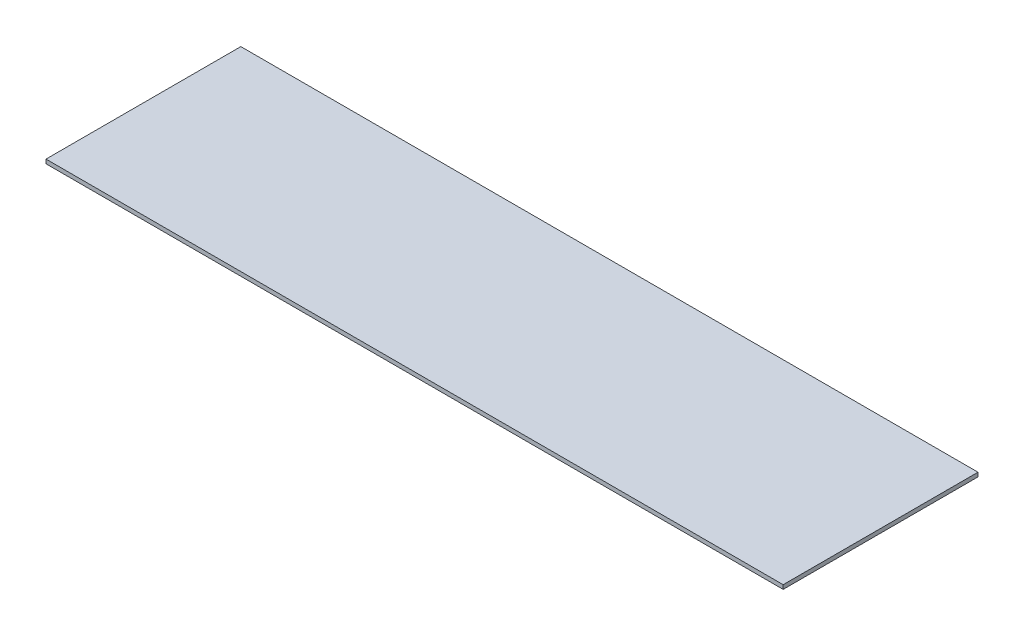
ISO-10303-21;
HEADER;
FILE_DESCRIPTION(('STEP AP214'),'2;1');
FILE_NAME('part.step','',(''),(''),'','','');
FILE_SCHEMA(('AUTOMOTIVE_DESIGN { 1 0 10303 214 1 1 1 1 }'));
ENDSEC;
DATA;
#1=APPLICATION_CONTEXT('core data for automotive mechanical design processes');
#2=APPLICATION_PROTOCOL_DEFINITION('international standard','automotive_design',2000,#1);
#3=PRODUCT_CONTEXT('',#1,'mechanical');
#4=PRODUCT('Part','Part','',(#3));
#5=PRODUCT_RELATED_PRODUCT_CATEGORY('part','',(#4));
#6=PRODUCT_DEFINITION_FORMATION('','',#4);
#7=PRODUCT_DEFINITION_CONTEXT('part definition',#1,'design');
#8=PRODUCT_DEFINITION('design','',#6,#7);
#9=PRODUCT_DEFINITION_SHAPE('','',#8);
#10=(LENGTH_UNIT() NAMED_UNIT(*) SI_UNIT(.MILLI.,.METRE.));
#11=(NAMED_UNIT(*) PLANE_ANGLE_UNIT() SI_UNIT($,.RADIAN.));
#12=(NAMED_UNIT(*) SI_UNIT($,.STERADIAN.) SOLID_ANGLE_UNIT());
#13=UNCERTAINTY_MEASURE_WITH_UNIT(LENGTH_MEASURE(1.E-05),#10,'distance_accuracy_value','');
#14=(GEOMETRIC_REPRESENTATION_CONTEXT(3) GLOBAL_UNCERTAINTY_ASSIGNED_CONTEXT((#13)) GLOBAL_UNIT_ASSIGNED_CONTEXT((#10,
#11,#12)) REPRESENTATION_CONTEXT('',''));
#15=CARTESIAN_POINT('',(0.,0.,0.));
#16=DIRECTION('',(0.,0.,1.));
#17=DIRECTION('',(1.,0.,0.));
#18=AXIS2_PLACEMENT_3D('',#15,#16,#17);
#19=CARTESIAN_POINT('',(0.,1.27,0.));
#20=DIRECTION('',(1.,0.,0.));
#21=DIRECTION('',(0.,0.,-1.));
#22=AXIS2_PLACEMENT_3D('',#19,#20,#21);
#23=PLANE('',#22);
#24=DIRECTION('',(0.,0.,1.));
#25=VECTOR('',#24,1.);
#26=CARTESIAN_POINT('',(0.,0.,0.));
#27=LINE('',#26,#25);
#28=CARTESIAN_POINT('',(0.,0.,-60.452));
#29=VERTEX_POINT('',#28);
#30=CARTESIAN_POINT('',(0.,0.,0.));
#31=VERTEX_POINT('',#30);
#32=EDGE_CURVE('E96',#29,#31,#27,.T.);
#33=ORIENTED_EDGE('',*,*,#32,.T.);
#34=DIRECTION('',(0.,-1.,0.));
#35=VECTOR('',#34,1.);
#36=CARTESIAN_POINT('',(0.,1.27,0.));
#37=LINE('',#36,#35);
#38=CARTESIAN_POINT('',(0.,1.27,0.));
#39=VERTEX_POINT('',#38);
#40=EDGE_CURVE('E11',#39,#31,#37,.T.);
#41=ORIENTED_EDGE('',*,*,#40,.F.);
#42=DIRECTION('',(0.,0.,1.));
#43=VECTOR('',#42,1.);
#44=CARTESIAN_POINT('',(0.,1.27,0.));
#45=LINE('',#44,#43);
#46=CARTESIAN_POINT('',(0.,1.27,-60.452));
#47=VERTEX_POINT('',#46);
#48=EDGE_CURVE('E84',#47,#39,#45,.T.);
#49=ORIENTED_EDGE('',*,*,#48,.F.);
#50=DIRECTION('',(0.,-1.,0.));
#51=VECTOR('',#50,1.);
#52=CARTESIAN_POINT('',(0.,1.27,-60.452));
#53=LINE('',#52,#51);
#54=EDGE_CURVE('E92',#47,#29,#53,.T.);
#55=ORIENTED_EDGE('',*,*,#54,.T.);
#56=EDGE_LOOP('',(#33,#41,#49,#55));
#57=FACE_BOUND('',#56,.T.);
#58=ADVANCED_FACE('F33',(#57),#23,.F.);
#59=CARTESIAN_POINT('',(0.,1.27,0.));
#60=DIRECTION('',(0.,0.,-1.));
#61=DIRECTION('',(-1.,0.,0.));
#62=AXIS2_PLACEMENT_3D('',#59,#60,#61);
#63=PLANE('',#62);
#64=DIRECTION('',(1.,0.,0.));
#65=VECTOR('',#64,1.);
#66=CARTESIAN_POINT('',(0.,0.,0.));
#67=LINE('',#66,#65);
#68=CARTESIAN_POINT('',(228.727,0.,0.));
#69=VERTEX_POINT('',#68);
#70=EDGE_CURVE('E88',#31,#69,#67,.T.);
#71=ORIENTED_EDGE('',*,*,#70,.T.);
#72=DIRECTION('',(0.,-1.,0.));
#73=VECTOR('',#72,1.);
#74=CARTESIAN_POINT('',(228.727,1.27,0.));
#75=LINE('',#74,#73);
#76=CARTESIAN_POINT('',(228.727,1.27,0.));
#77=VERTEX_POINT('',#76);
#78=EDGE_CURVE('E41',#77,#69,#75,.T.);
#79=ORIENTED_EDGE('',*,*,#78,.F.);
#80=DIRECTION('',(1.,0.,0.));
#81=VECTOR('',#80,1.);
#82=CARTESIAN_POINT('',(0.,1.27,0.));
#83=LINE('',#82,#81);
#84=EDGE_CURVE('E79',#39,#77,#83,.T.);
#85=ORIENTED_EDGE('',*,*,#84,.F.);
#86=ORIENTED_EDGE('',*,*,#40,.T.);
#87=EDGE_LOOP('',(#71,#79,#85,#86));
#88=FACE_BOUND('',#87,.T.);
#89=ADVANCED_FACE('F87',(#88),#63,.F.);
#90=CARTESIAN_POINT('',(228.727,1.27,0.));
#91=DIRECTION('',(-1.,0.,0.));
#92=DIRECTION('',(0.,0.,1.));
#93=AXIS2_PLACEMENT_3D('',#90,#91,#92);
#94=PLANE('',#93);
#95=DIRECTION('',(0.,0.,-1.));
#96=VECTOR('',#95,1.);
#97=CARTESIAN_POINT('',(228.727,0.,0.));
#98=LINE('',#97,#96);
#99=CARTESIAN_POINT('',(228.727,0.,-60.452));
#100=VERTEX_POINT('',#99);
#101=EDGE_CURVE('E66',#69,#100,#98,.T.);
#102=ORIENTED_EDGE('',*,*,#101,.T.);
#103=DIRECTION('',(0.,-1.,0.));
#104=VECTOR('',#103,1.);
#105=CARTESIAN_POINT('',(228.727,1.27,-60.452));
#106=LINE('',#105,#104);
#107=CARTESIAN_POINT('',(228.727,1.27,-60.452));
#108=VERTEX_POINT('',#107);
#109=EDGE_CURVE('E89',#108,#100,#106,.T.);
#110=ORIENTED_EDGE('',*,*,#109,.F.);
#111=DIRECTION('',(0.,0.,-1.));
#112=VECTOR('',#111,1.);
#113=CARTESIAN_POINT('',(228.727,1.27,0.));
#114=LINE('',#113,#112);
#115=EDGE_CURVE('E82',#77,#108,#114,.T.);
#116=ORIENTED_EDGE('',*,*,#115,.F.);
#117=ORIENTED_EDGE('',*,*,#78,.T.);
#118=EDGE_LOOP('',(#102,#110,#116,#117));
#119=FACE_BOUND('',#118,.T.);
#120=ADVANCED_FACE('F90',(#119),#94,.F.);
#121=CARTESIAN_POINT('',(0.,1.27,-60.452));
#122=DIRECTION('',(0.,0.,1.));
#123=DIRECTION('',(1.,0.,0.));
#124=AXIS2_PLACEMENT_3D('',#121,#122,#123);
#125=PLANE('',#124);
#126=DIRECTION('',(-1.,0.,0.));
#127=VECTOR('',#126,1.);
#128=CARTESIAN_POINT('',(0.,0.,-60.452));
#129=LINE('',#128,#127);
#130=EDGE_CURVE('E72',#100,#29,#129,.T.);
#131=ORIENTED_EDGE('',*,*,#130,.T.);
#132=ORIENTED_EDGE('',*,*,#54,.F.);
#133=DIRECTION('',(-1.,0.,0.));
#134=VECTOR('',#133,1.);
#135=CARTESIAN_POINT('',(0.,1.27,-60.452));
#136=LINE('',#135,#134);
#137=EDGE_CURVE('E49',#108,#47,#136,.T.);
#138=ORIENTED_EDGE('',*,*,#137,.F.);
#139=ORIENTED_EDGE('',*,*,#109,.T.);
#140=EDGE_LOOP('',(#131,#132,#138,#139));
#141=FACE_BOUND('',#140,.T.);
#142=ADVANCED_FACE('F103',(#141),#125,.F.);
#143=CARTESIAN_POINT('',(0.,1.27,0.));
#144=DIRECTION('',(0.,-1.,0.));
#145=DIRECTION('',(0.,0.,-1.));
#146=AXIS2_PLACEMENT_3D('',#143,#144,#145);
#147=PLANE('',#146);
#148=ORIENTED_EDGE('',*,*,#48,.T.);
#149=ORIENTED_EDGE('',*,*,#84,.T.);
#150=ORIENTED_EDGE('',*,*,#115,.T.);
#151=ORIENTED_EDGE('',*,*,#137,.T.);
#152=EDGE_LOOP('',(#148,#149,#150,#151));
#153=FACE_BOUND('',#152,.T.);
#154=ADVANCED_FACE('F80',(#153),#147,.F.);
#155=CARTESIAN_POINT('',(0.,0.,0.));
#156=DIRECTION('',(0.,-1.,0.));
#157=DIRECTION('',(0.,0.,-1.));
#158=AXIS2_PLACEMENT_3D('',#155,#156,#157);
#159=PLANE('',#158);
#160=ORIENTED_EDGE('',*,*,#32,.F.);
#161=ORIENTED_EDGE('',*,*,#130,.F.);
#162=ORIENTED_EDGE('',*,*,#101,.F.);
#163=ORIENTED_EDGE('',*,*,#70,.F.);
#164=EDGE_LOOP('',(#160,#161,#162,#163));
#165=FACE_BOUND('',#164,.T.);
#166=ADVANCED_FACE('F106',(#165),#159,.T.);
#167=CLOSED_SHELL('',(#58,#89,#120,#142,#154,#166));
#168=MANIFOLD_SOLID_BREP('B2',#167);
#169=ADVANCED_BREP_SHAPE_REPRESENTATION('',(#18,#168),#14);
#170=SHAPE_DEFINITION_REPRESENTATION(#9,#169);
ENDSEC;
END-ISO-10303-21;
